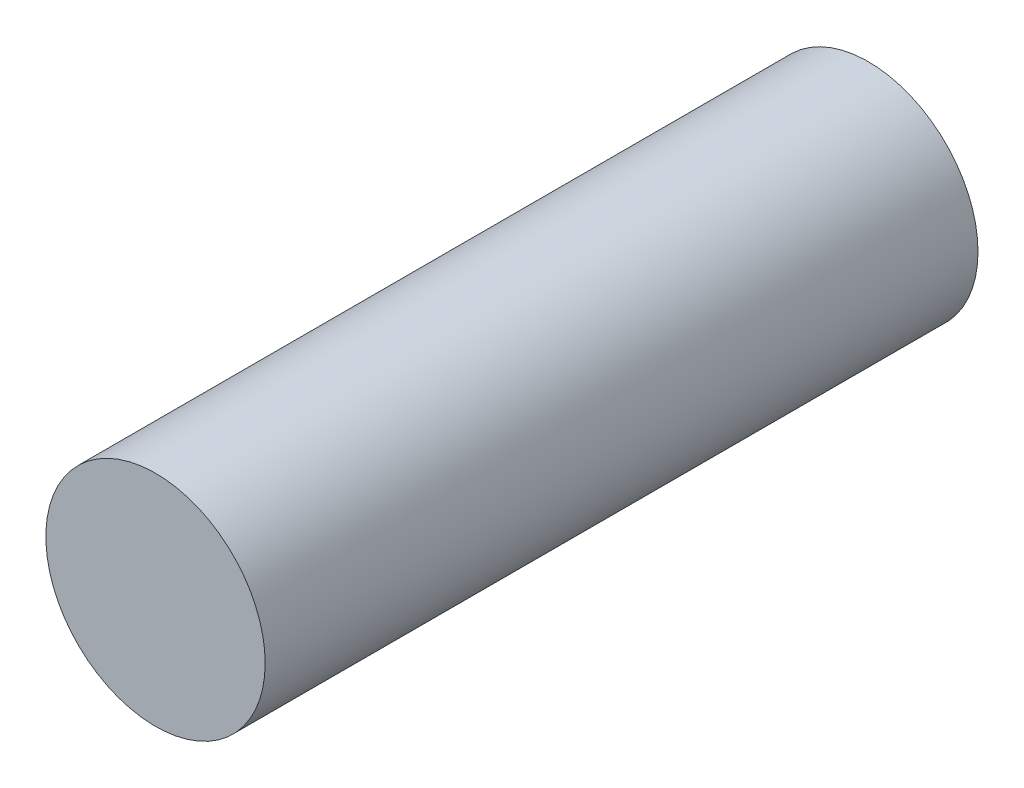
ISO-10303-21;
HEADER;
FILE_DESCRIPTION(('STEP AP214'),'2;1');
FILE_NAME('part.step','',(''),(''),'','','');
FILE_SCHEMA(('AUTOMOTIVE_DESIGN { 1 0 10303 214 1 1 1 1 }'));
ENDSEC;
DATA;
#1=APPLICATION_CONTEXT('core data for automotive mechanical design processes');
#2=APPLICATION_PROTOCOL_DEFINITION('international standard','automotive_design',2000,#1);
#3=PRODUCT_CONTEXT('',#1,'mechanical');
#4=PRODUCT('Part','Part','',(#3));
#5=PRODUCT_RELATED_PRODUCT_CATEGORY('part','',(#4));
#6=PRODUCT_DEFINITION_FORMATION('','',#4);
#7=PRODUCT_DEFINITION_CONTEXT('part definition',#1,'design');
#8=PRODUCT_DEFINITION('design','',#6,#7);
#9=PRODUCT_DEFINITION_SHAPE('','',#8);
#10=(LENGTH_UNIT() NAMED_UNIT(*) SI_UNIT(.MILLI.,.METRE.));
#11=(NAMED_UNIT(*) PLANE_ANGLE_UNIT() SI_UNIT($,.RADIAN.));
#12=(NAMED_UNIT(*) SI_UNIT($,.STERADIAN.) SOLID_ANGLE_UNIT());
#13=UNCERTAINTY_MEASURE_WITH_UNIT(LENGTH_MEASURE(1.E-05),#10,'distance_accuracy_value','');
#14=(GEOMETRIC_REPRESENTATION_CONTEXT(3) GLOBAL_UNCERTAINTY_ASSIGNED_CONTEXT((#13)) GLOBAL_UNIT_ASSIGNED_CONTEXT((#10,
#11,#12)) REPRESENTATION_CONTEXT('',''));
#15=CARTESIAN_POINT('',(0.,0.,0.));
#16=DIRECTION('',(0.,0.,1.));
#17=DIRECTION('',(1.,0.,0.));
#18=AXIS2_PLACEMENT_3D('',#15,#16,#17);
#19=CARTESIAN_POINT('',(0.,0.,130.));
#20=DIRECTION('',(0.,0.,-1.));
#21=DIRECTION('',(-1.,0.,0.));
#22=AXIS2_PLACEMENT_3D('',#19,#20,#21);
#23=CYLINDRICAL_SURFACE('',#22,20.);
#24=CARTESIAN_POINT('',(0.,0.,130.));
#25=DIRECTION('',(0.,0.,1.));
#26=DIRECTION('',(1.,0.,0.));
#27=AXIS2_PLACEMENT_3D('',#24,#25,#26);
#28=CIRCLE('',#27,20.);
#29=CARTESIAN_POINT('',(20.,0.,130.));
#30=VERTEX_POINT('',#29);
#31=EDGE_CURVE('E10',#30,#30,#28,.T.);
#32=ORIENTED_EDGE('',*,*,#31,.F.);
#33=EDGE_LOOP('',(#32));
#34=FACE_BOUND('',#33,.T.);
#35=CARTESIAN_POINT('',(0.,0.,0.));
#36=DIRECTION('',(0.,0.,1.));
#37=DIRECTION('',(1.,0.,0.));
#38=AXIS2_PLACEMENT_3D('',#35,#36,#37);
#39=CIRCLE('',#38,20.);
#40=CARTESIAN_POINT('',(20.,0.,0.));
#41=VERTEX_POINT('',#40);
#42=EDGE_CURVE('E40',#41,#41,#39,.T.);
#43=ORIENTED_EDGE('',*,*,#42,.T.);
#44=EDGE_LOOP('',(#43));
#45=FACE_BOUND('',#44,.T.);
#46=ADVANCED_FACE('F37',(#34,#45),#23,.T.);
#47=CARTESIAN_POINT('',(0.,0.,130.));
#48=DIRECTION('',(0.,0.,1.));
#49=DIRECTION('',(1.,0.,0.));
#50=AXIS2_PLACEMENT_3D('',#47,#48,#49);
#51=PLANE('',#50);
#52=ORIENTED_EDGE('',*,*,#31,.T.);
#53=EDGE_LOOP('',(#52));
#54=FACE_BOUND('',#53,.T.);
#55=ADVANCED_FACE('F54',(#54),#51,.T.);
#56=CARTESIAN_POINT('',(0.,0.,0.));
#57=DIRECTION('',(0.,0.,1.));
#58=DIRECTION('',(1.,0.,0.));
#59=AXIS2_PLACEMENT_3D('',#56,#57,#58);
#60=PLANE('',#59);
#61=ORIENTED_EDGE('',*,*,#42,.F.);
#62=EDGE_LOOP('',(#61));
#63=FACE_BOUND('',#62,.T.);
#64=ADVANCED_FACE('F52',(#63),#60,.F.);
#65=CLOSED_SHELL('',(#46,#55,#64));
#66=MANIFOLD_SOLID_BREP('B2',#65);
#67=ADVANCED_BREP_SHAPE_REPRESENTATION('',(#18,#66),#14);
#68=SHAPE_DEFINITION_REPRESENTATION(#9,#67);
ENDSEC;
END-ISO-10303-21;
